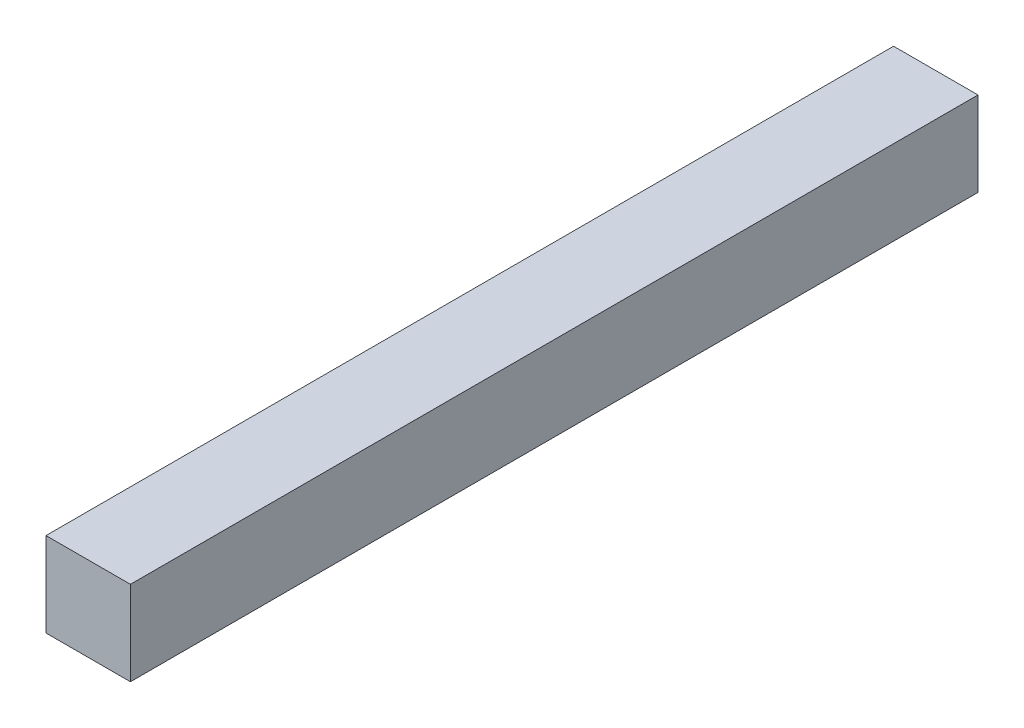
ISO-10303-21;
HEADER;
FILE_DESCRIPTION(('STEP AP214'),'2;1');
FILE_NAME('part.step','',(''),(''),'','','');
FILE_SCHEMA(('AUTOMOTIVE_DESIGN { 1 0 10303 214 1 1 1 1 }'));
ENDSEC;
DATA;
#1=APPLICATION_CONTEXT('core data for automotive mechanical design processes');
#2=APPLICATION_PROTOCOL_DEFINITION('international standard','automotive_design',2000,#1);
#3=PRODUCT_CONTEXT('',#1,'mechanical');
#4=PRODUCT('Part','Part','',(#3));
#5=PRODUCT_RELATED_PRODUCT_CATEGORY('part','',(#4));
#6=PRODUCT_DEFINITION_FORMATION('','',#4);
#7=PRODUCT_DEFINITION_CONTEXT('part definition',#1,'design');
#8=PRODUCT_DEFINITION('design','',#6,#7);
#9=PRODUCT_DEFINITION_SHAPE('','',#8);
#10=(LENGTH_UNIT() NAMED_UNIT(*) SI_UNIT(.MILLI.,.METRE.));
#11=(NAMED_UNIT(*) PLANE_ANGLE_UNIT() SI_UNIT($,.RADIAN.));
#12=(NAMED_UNIT(*) SI_UNIT($,.STERADIAN.) SOLID_ANGLE_UNIT());
#13=UNCERTAINTY_MEASURE_WITH_UNIT(LENGTH_MEASURE(1.E-05),#10,'distance_accuracy_value','');
#14=(GEOMETRIC_REPRESENTATION_CONTEXT(3) GLOBAL_UNCERTAINTY_ASSIGNED_CONTEXT((#13)) GLOBAL_UNIT_ASSIGNED_CONTEXT((#10,
#11,#12)) REPRESENTATION_CONTEXT('',''));
#15=CARTESIAN_POINT('',(0.,0.,0.));
#16=DIRECTION('',(0.,0.,1.));
#17=DIRECTION('',(1.,0.,0.));
#18=AXIS2_PLACEMENT_3D('',#15,#16,#17);
#19=CARTESIAN_POINT('',(-22.7495533772294,59.4566692938178,112.227241805575));
#20=DIRECTION('',(-1.,0.,0.));
#21=DIRECTION('',(0.,0.,1.));
#22=AXIS2_PLACEMENT_3D('',#19,#20,#21);
#23=PLANE('',#22);
#24=DIRECTION('',(0.,1.,0.));
#25=VECTOR('',#24,1.);
#26=CARTESIAN_POINT('',(-22.7495533772294,59.4566692938178,35.7224418055753));
#27=LINE('',#26,#25);
#28=CARTESIAN_POINT('',(-22.7495533772294,51.8366692938178,35.7224418055753));
#29=VERTEX_POINT('',#28);
#30=CARTESIAN_POINT('',(-22.7495533772294,59.4566692938178,35.7224418055753));
#31=VERTEX_POINT('',#30);
#32=EDGE_CURVE('E97',#29,#31,#27,.T.);
#33=ORIENTED_EDGE('',*,*,#32,.T.);
#34=DIRECTION('',(0.,0.,-1.));
#35=VECTOR('',#34,1.);
#36=CARTESIAN_POINT('',(-22.7495533772294,59.4566692938178,112.227241805575));
#37=LINE('',#36,#35);
#38=CARTESIAN_POINT('',(-22.7495533772294,59.4566692938178,112.227241805575));
#39=VERTEX_POINT('',#38);
#40=EDGE_CURVE('E11',#39,#31,#37,.T.);
#41=ORIENTED_EDGE('',*,*,#40,.F.);
#42=DIRECTION('',(0.,1.,0.));
#43=VECTOR('',#42,1.);
#44=CARTESIAN_POINT('',(-22.7495533772294,59.4566692938178,112.227241805575));
#45=LINE('',#44,#43);
#46=CARTESIAN_POINT('',(-22.7495533772294,51.8366692938178,112.227241805575));
#47=VERTEX_POINT('',#46);
#48=EDGE_CURVE('E85',#47,#39,#45,.T.);
#49=ORIENTED_EDGE('',*,*,#48,.F.);
#50=DIRECTION('',(0.,0.,-1.));
#51=VECTOR('',#50,1.);
#52=CARTESIAN_POINT('',(-22.7495533772294,51.8366692938178,112.227241805575));
#53=LINE('',#52,#51);
#54=EDGE_CURVE('E93',#47,#29,#53,.T.);
#55=ORIENTED_EDGE('',*,*,#54,.T.);
#56=EDGE_LOOP('',(#33,#41,#49,#55));
#57=FACE_BOUND('',#56,.T.);
#58=ADVANCED_FACE('F34',(#57),#23,.F.);
#59=CARTESIAN_POINT('',(-22.7495533772294,59.4566692938178,112.227241805575));
#60=DIRECTION('',(0.,-1.,0.));
#61=DIRECTION('',(0.,0.,-1.));
#62=AXIS2_PLACEMENT_3D('',#59,#60,#61);
#63=PLANE('',#62);
#64=DIRECTION('',(-1.,0.,0.));
#65=VECTOR('',#64,1.);
#66=CARTESIAN_POINT('',(-22.7495533772294,59.4566692938178,35.7224418055753));
#67=LINE('',#66,#65);
#68=CARTESIAN_POINT('',(-30.3695533772294,59.4566692938178,35.7224418055753));
#69=VERTEX_POINT('',#68);
#70=EDGE_CURVE('E89',#31,#69,#67,.T.);
#71=ORIENTED_EDGE('',*,*,#70,.T.);
#72=DIRECTION('',(0.,0.,-1.));
#73=VECTOR('',#72,1.);
#74=CARTESIAN_POINT('',(-30.3695533772294,59.4566692938178,112.227241805575));
#75=LINE('',#74,#73);
#76=CARTESIAN_POINT('',(-30.3695533772294,59.4566692938178,112.227241805575));
#77=VERTEX_POINT('',#76);
#78=EDGE_CURVE('E42',#77,#69,#75,.T.);
#79=ORIENTED_EDGE('',*,*,#78,.F.);
#80=DIRECTION('',(-1.,0.,0.));
#81=VECTOR('',#80,1.);
#82=CARTESIAN_POINT('',(-22.7495533772294,59.4566692938178,112.227241805575));
#83=LINE('',#82,#81);
#84=EDGE_CURVE('E80',#39,#77,#83,.T.);
#85=ORIENTED_EDGE('',*,*,#84,.F.);
#86=ORIENTED_EDGE('',*,*,#40,.T.);
#87=EDGE_LOOP('',(#71,#79,#85,#86));
#88=FACE_BOUND('',#87,.T.);
#89=ADVANCED_FACE('F88',(#88),#63,.F.);
#90=CARTESIAN_POINT('',(-30.3695533772294,59.4566692938178,112.227241805575));
#91=DIRECTION('',(1.,0.,0.));
#92=DIRECTION('',(0.,0.,-1.));
#93=AXIS2_PLACEMENT_3D('',#90,#91,#92);
#94=PLANE('',#93);
#95=DIRECTION('',(0.,-1.,0.));
#96=VECTOR('',#95,1.);
#97=CARTESIAN_POINT('',(-30.3695533772294,59.4566692938178,35.7224418055753));
#98=LINE('',#97,#96);
#99=CARTESIAN_POINT('',(-30.3695533772294,51.8366692938178,35.7224418055753));
#100=VERTEX_POINT('',#99);
#101=EDGE_CURVE('E67',#69,#100,#98,.T.);
#102=ORIENTED_EDGE('',*,*,#101,.T.);
#103=DIRECTION('',(0.,0.,-1.));
#104=VECTOR('',#103,1.);
#105=CARTESIAN_POINT('',(-30.3695533772294,51.8366692938178,112.227241805575));
#106=LINE('',#105,#104);
#107=CARTESIAN_POINT('',(-30.3695533772294,51.8366692938178,112.227241805575));
#108=VERTEX_POINT('',#107);
#109=EDGE_CURVE('E90',#108,#100,#106,.T.);
#110=ORIENTED_EDGE('',*,*,#109,.F.);
#111=DIRECTION('',(0.,-1.,0.));
#112=VECTOR('',#111,1.);
#113=CARTESIAN_POINT('',(-30.3695533772294,59.4566692938178,112.227241805575));
#114=LINE('',#113,#112);
#115=EDGE_CURVE('E83',#77,#108,#114,.T.);
#116=ORIENTED_EDGE('',*,*,#115,.F.);
#117=ORIENTED_EDGE('',*,*,#78,.T.);
#118=EDGE_LOOP('',(#102,#110,#116,#117));
#119=FACE_BOUND('',#118,.T.);
#120=ADVANCED_FACE('F91',(#119),#94,.F.);
#121=CARTESIAN_POINT('',(-22.7495533772294,51.8366692938178,112.227241805575));
#122=DIRECTION('',(0.,1.,0.));
#123=DIRECTION('',(0.,0.,1.));
#124=AXIS2_PLACEMENT_3D('',#121,#122,#123);
#125=PLANE('',#124);
#126=DIRECTION('',(1.,0.,0.));
#127=VECTOR('',#126,1.);
#128=CARTESIAN_POINT('',(-22.7495533772294,51.8366692938178,35.7224418055753));
#129=LINE('',#128,#127);
#130=EDGE_CURVE('E73',#100,#29,#129,.T.);
#131=ORIENTED_EDGE('',*,*,#130,.T.);
#132=ORIENTED_EDGE('',*,*,#54,.F.);
#133=DIRECTION('',(1.,0.,0.));
#134=VECTOR('',#133,1.);
#135=CARTESIAN_POINT('',(-22.7495533772294,51.8366692938178,112.227241805575));
#136=LINE('',#135,#134);
#137=EDGE_CURVE('E50',#108,#47,#136,.T.);
#138=ORIENTED_EDGE('',*,*,#137,.F.);
#139=ORIENTED_EDGE('',*,*,#109,.T.);
#140=EDGE_LOOP('',(#131,#132,#138,#139));
#141=FACE_BOUND('',#140,.T.);
#142=ADVANCED_FACE('F104',(#141),#125,.F.);
#143=CARTESIAN_POINT('',(0.,0.,112.227241805575));
#144=DIRECTION('',(0.,0.,-1.));
#145=DIRECTION('',(-1.,0.,0.));
#146=AXIS2_PLACEMENT_3D('',#143,#144,#145);
#147=PLANE('',#146);
#148=ORIENTED_EDGE('',*,*,#48,.T.);
#149=ORIENTED_EDGE('',*,*,#84,.T.);
#150=ORIENTED_EDGE('',*,*,#115,.T.);
#151=ORIENTED_EDGE('',*,*,#137,.T.);
#152=EDGE_LOOP('',(#148,#149,#150,#151));
#153=FACE_BOUND('',#152,.T.);
#154=ADVANCED_FACE('F81',(#153),#147,.F.);
#155=CARTESIAN_POINT('',(0.,0.,35.7224418055753));
#156=DIRECTION('',(0.,0.,-1.));
#157=DIRECTION('',(-1.,0.,0.));
#158=AXIS2_PLACEMENT_3D('',#155,#156,#157);
#159=PLANE('',#158);
#160=ORIENTED_EDGE('',*,*,#32,.F.);
#161=ORIENTED_EDGE('',*,*,#130,.F.);
#162=ORIENTED_EDGE('',*,*,#101,.F.);
#163=ORIENTED_EDGE('',*,*,#70,.F.);
#164=EDGE_LOOP('',(#160,#161,#162,#163));
#165=FACE_BOUND('',#164,.T.);
#166=ADVANCED_FACE('F107',(#165),#159,.T.);
#167=CLOSED_SHELL('',(#58,#89,#120,#142,#154,#166));
#168=MANIFOLD_SOLID_BREP('B2',#167);
#169=ADVANCED_BREP_SHAPE_REPRESENTATION('',(#18,#168),#14);
#170=SHAPE_DEFINITION_REPRESENTATION(#9,#169);
ENDSEC;
END-ISO-10303-21;
